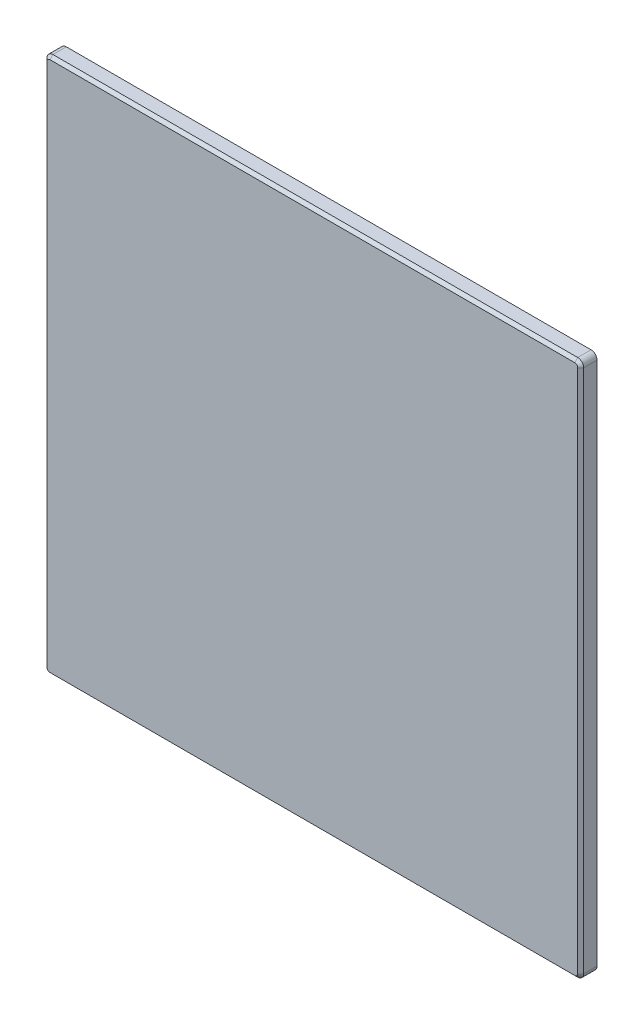
ISO-10303-21;
HEADER;
FILE_DESCRIPTION(('STEP AP214'),'2;1');
FILE_NAME('part.step','',(''),(''),'','','');
FILE_SCHEMA(('AUTOMOTIVE_DESIGN { 1 0 10303 214 1 1 1 1 }'));
ENDSEC;
DATA;
#1=APPLICATION_CONTEXT('core data for automotive mechanical design processes');
#2=APPLICATION_PROTOCOL_DEFINITION('international standard','automotive_design',2000,#1);
#3=PRODUCT_CONTEXT('',#1,'mechanical');
#4=PRODUCT('Part','Part','',(#3));
#5=PRODUCT_RELATED_PRODUCT_CATEGORY('part','',(#4));
#6=PRODUCT_DEFINITION_FORMATION('','',#4);
#7=PRODUCT_DEFINITION_CONTEXT('part definition',#1,'design');
#8=PRODUCT_DEFINITION('design','',#6,#7);
#9=PRODUCT_DEFINITION_SHAPE('','',#8);
#10=(LENGTH_UNIT() NAMED_UNIT(*) SI_UNIT(.MILLI.,.METRE.));
#11=(NAMED_UNIT(*) PLANE_ANGLE_UNIT() SI_UNIT($,.RADIAN.));
#12=(NAMED_UNIT(*) SI_UNIT($,.STERADIAN.) SOLID_ANGLE_UNIT());
#13=UNCERTAINTY_MEASURE_WITH_UNIT(LENGTH_MEASURE(1.E-05),#10,'distance_accuracy_value','');
#14=(GEOMETRIC_REPRESENTATION_CONTEXT(3) GLOBAL_UNCERTAINTY_ASSIGNED_CONTEXT((#13)) GLOBAL_UNIT_ASSIGNED_CONTEXT((#10,
#11,#12)) REPRESENTATION_CONTEXT('',''));
#15=CARTESIAN_POINT('',(0.,0.,0.));
#16=DIRECTION('',(0.,0.,1.));
#17=DIRECTION('',(1.,0.,0.));
#18=AXIS2_PLACEMENT_3D('',#15,#16,#17);
#19=CARTESIAN_POINT('',(-8.83,-8.83000000000001,0.55));
#20=DIRECTION('',(0.,0.,1.));
#21=DIRECTION('',(1.,0.,0.));
#22=AXIS2_PLACEMENT_3D('',#19,#20,#21);
#23=PLANE('',#22);
#24=DIRECTION('',(0.,1.,0.));
#25=VECTOR('',#24,1.);
#26=CARTESIAN_POINT('',(8.93,-8.83000000000001,0.55));
#27=LINE('',#26,#25);
#28=CARTESIAN_POINT('',(8.93000000000684,8.83,0.550000000010141));
#29=VERTEX_POINT('',#28);
#30=CARTESIAN_POINT('',(8.92999999998377,-8.83000000000001,0.550000000016235));
#31=VERTEX_POINT('',#30);
#32=EDGE_CURVE('E121',#29,#31,#27,.F.);
#33=ORIENTED_EDGE('',*,*,#32,.F.);
#34=CARTESIAN_POINT('',(8.82999999999999,8.83,0.549999999975626));
#35=DIRECTION('',(0.,0.,-1.));
#36=DIRECTION('',(0.,1.,0.));
#37=AXIS2_PLACEMENT_3D('',#34,#35,#36);
#38=CIRCLE('',#37,0.10000000009956);
#39=CARTESIAN_POINT('',(8.82999999999999,8.93000000001219,0.549999999987813));
#40=VERTEX_POINT('',#39);
#41=EDGE_CURVE('E144',#40,#29,#38,.T.);
#42=ORIENTED_EDGE('',*,*,#41,.F.);
#43=DIRECTION('',(1.,0.,0.));
#44=VECTOR('',#43,1.);
#45=CARTESIAN_POINT('',(-8.83,8.93,0.55));
#46=LINE('',#45,#44);
#47=CARTESIAN_POINT('',(-8.82999999999999,8.92999999998745,0.550000000032469));
#48=VERTEX_POINT('',#47);
#49=EDGE_CURVE('E116',#48,#40,#46,.T.);
#50=ORIENTED_EDGE('',*,*,#49,.F.);
#51=CARTESIAN_POINT('',(-8.82999999999999,8.83,0.550000000032469));
#52=DIRECTION('',(0.,0.,-1.));
#53=DIRECTION('',(0.,1.,0.));
#54=AXIS2_PLACEMENT_3D('',#51,#52,#53);
#55=CIRCLE('',#54,0.0999999999639224);
#56=CARTESIAN_POINT('',(-8.92999999998377,8.83,0.550000000016235));
#57=VERTEX_POINT('',#56);
#58=EDGE_CURVE('E141',#57,#48,#55,.T.);
#59=ORIENTED_EDGE('',*,*,#58,.F.);
#60=DIRECTION('',(0.,1.,0.));
#61=VECTOR('',#60,1.);
#62=CARTESIAN_POINT('',(-8.93,-8.83000000000001,0.55));
#63=LINE('',#62,#61);
#64=CARTESIAN_POINT('',(-8.93000000001219,-8.83000000000001,0.549999999987813));
#65=VERTEX_POINT('',#64);
#66=EDGE_CURVE('E97',#65,#57,#63,.T.);
#67=ORIENTED_EDGE('',*,*,#66,.F.);
#68=CARTESIAN_POINT('',(-8.83,-8.83000000000001,0.549999999975626));
#69=DIRECTION('',(0.,0.,-1.));
#70=DIRECTION('',(-1.,0.,0.));
#71=AXIS2_PLACEMENT_3D('',#68,#69,#70);
#72=CIRCLE('',#71,0.100000000020754);
#73=CARTESIAN_POINT('',(-8.83,-8.9300000000122,0.549999999987813));
#74=VERTEX_POINT('',#73);
#75=EDGE_CURVE('E20',#74,#65,#72,.T.);
#76=ORIENTED_EDGE('',*,*,#75,.F.);
#77=DIRECTION('',(1.,0.,0.));
#78=VECTOR('',#77,1.);
#79=CARTESIAN_POINT('',(-8.83,-8.93000000000001,0.55));
#80=LINE('',#79,#78);
#81=CARTESIAN_POINT('',(8.83,-8.92999999998746,0.550000000032469));
#82=VERTEX_POINT('',#81);
#83=EDGE_CURVE('E82',#82,#74,#80,.F.);
#84=ORIENTED_EDGE('',*,*,#83,.F.);
#85=CARTESIAN_POINT('',(8.83,-8.83000000000001,0.550000000032469));
#86=DIRECTION('',(0.,0.,-1.));
#87=DIRECTION('',(-1.,0.,0.));
#88=AXIS2_PLACEMENT_3D('',#85,#86,#87);
#89=CIRCLE('',#88,0.0999999999858857);
#90=EDGE_CURVE('E106',#31,#82,#89,.T.);
#91=ORIENTED_EDGE('',*,*,#90,.F.);
#92=EDGE_LOOP('',(#33,#42,#50,#59,#67,#76,#84,#91));
#93=FACE_BOUND('',#92,.T.);
#94=ADVANCED_FACE('F17',(#93),#23,.T.);
#95=CARTESIAN_POINT('',(-8.83,-8.83000000000001,0.449999999830197));
#96=DIRECTION('',(0.,0.,-1.));
#97=DIRECTION('',(-1.,0.,0.));
#98=AXIS2_PLACEMENT_3D('',#95,#96,#97);
#99=CONICAL_SURFACE('',#98,0.199999999995652,0.785398162544797);
#100=DIRECTION('',(0.707106781186545,0.,0.70710678118655));
#101=VECTOR('',#100,1.);
#102=CARTESIAN_POINT('',(-8.93,-8.83000000000001,0.55));
#103=LINE('',#102,#101);
#104=CARTESIAN_POINT('',(-9.03,-8.83000000000001,0.45));
#105=VERTEX_POINT('',#104);
#106=EDGE_CURVE('E115',#105,#65,#103,.T.);
#107=ORIENTED_EDGE('',*,*,#106,.F.);
#108=CARTESIAN_POINT('',(-8.83,-8.83000000000001,0.45));
#109=DIRECTION('',(0.,0.,-1.));
#110=DIRECTION('',(-1.,0.,0.));
#111=AXIS2_PLACEMENT_3D('',#108,#109,#110);
#112=CIRCLE('',#111,0.200000000000001);
#113=CARTESIAN_POINT('',(-8.83,-9.03000000000001,0.45));
#114=VERTEX_POINT('',#113);
#115=EDGE_CURVE('E103',#114,#105,#112,.T.);
#116=ORIENTED_EDGE('',*,*,#115,.F.);
#117=DIRECTION('',(0.,-0.707106781186545,-0.70710678118655));
#118=VECTOR('',#117,1.);
#119=CARTESIAN_POINT('',(-8.83,-8.93000000000001,0.55));
#120=LINE('',#119,#118);
#121=EDGE_CURVE('E87',#74,#114,#120,.T.);
#122=ORIENTED_EDGE('',*,*,#121,.F.);
#123=ORIENTED_EDGE('',*,*,#75,.T.);
#124=EDGE_LOOP('',(#107,#116,#122,#123));
#125=FACE_BOUND('',#124,.T.);
#126=ADVANCED_FACE('F101',(#125),#99,.T.);
#127=CARTESIAN_POINT('',(-8.83,-8.93000000000001,0.55));
#128=DIRECTION('',(0.,-0.70710678118655,0.707106781186545));
#129=DIRECTION('',(0.,-0.707106781186545,-0.70710678118655));
#130=AXIS2_PLACEMENT_3D('',#127,#128,#129);
#131=PLANE('',#130);
#132=ORIENTED_EDGE('',*,*,#121,.T.);
#133=DIRECTION('',(1.,0.,0.));
#134=VECTOR('',#133,1.);
#135=CARTESIAN_POINT('',(-8.83,-9.03000000000001,0.45));
#136=LINE('',#135,#134);
#137=CARTESIAN_POINT('',(8.83,-9.0299999999705,0.44999999997176));
#138=VERTEX_POINT('',#137);
#139=EDGE_CURVE('E164',#114,#138,#136,.T.);
#140=ORIENTED_EDGE('',*,*,#139,.T.);
#141=DIRECTION('',(0.,0.707106780551956,0.707106781821139));
#142=VECTOR('',#141,1.);
#143=CARTESIAN_POINT('',(8.83000000009167,-499009.479104346,-499000.));
#144=LINE('',#143,#142);
#145=EDGE_CURVE('E90',#82,#138,#144,.F.);
#146=ORIENTED_EDGE('',*,*,#145,.F.);
#147=ORIENTED_EDGE('',*,*,#83,.T.);
#148=EDGE_LOOP('',(#132,#140,#146,#147));
#149=FACE_BOUND('',#148,.T.);
#150=ADVANCED_FACE('F84',(#149),#131,.T.);
#151=CARTESIAN_POINT('',(8.83,-8.83000000000001,0.449999999887041));
#152=DIRECTION('',(0.,0.,-1.));
#153=DIRECTION('',(-1.,0.,0.));
#154=AXIS2_PLACEMENT_3D('',#151,#152,#153);
#155=CONICAL_SURFACE('',#154,0.19999999990394,0.78539816226058);
#156=DIRECTION('',(0.707106781186545,0.,-0.70710678118655));
#157=VECTOR('',#156,1.);
#158=CARTESIAN_POINT('',(8.93,-8.83000000000001,0.55));
#159=LINE('',#158,#157);
#160=CARTESIAN_POINT('',(9.03,-8.83000000000001,0.45));
#161=VERTEX_POINT('',#160);
#162=EDGE_CURVE('E124',#31,#161,#159,.T.);
#163=ORIENTED_EDGE('',*,*,#162,.F.);
#164=ORIENTED_EDGE('',*,*,#90,.T.);
#165=ORIENTED_EDGE('',*,*,#145,.T.);
#166=CARTESIAN_POINT('',(8.83,-8.83000000000001,0.45));
#167=DIRECTION('',(0.,0.,-1.));
#168=DIRECTION('',(-1.,0.,0.));
#169=AXIS2_PLACEMENT_3D('',#166,#167,#168);
#170=CIRCLE('',#169,0.199999999999999);
#171=EDGE_CURVE('E160',#161,#138,#170,.T.);
#172=ORIENTED_EDGE('',*,*,#171,.F.);
#173=EDGE_LOOP('',(#163,#164,#165,#172));
#174=FACE_BOUND('',#173,.T.);
#175=ADVANCED_FACE('F300',(#174),#155,.T.);
#176=CARTESIAN_POINT('',(8.93,-8.83000000000001,0.55));
#177=DIRECTION('',(0.70710678118655,0.,0.707106781186545));
#178=DIRECTION('',(0.707106781186545,0.,-0.70710678118655));
#179=AXIS2_PLACEMENT_3D('',#176,#177,#178);
#180=PLANE('',#179);
#181=DIRECTION('',(-0.707106780551954,0.,0.707106781821141));
#182=VECTOR('',#181,1.);
#183=CARTESIAN_POINT('',(499009.479104343,8.83000000006111,-499000.));
#184=LINE('',#183,#182);
#185=CARTESIAN_POINT('',(9.02999999997049,8.83,0.449999999985971));
#186=VERTEX_POINT('',#185);
#187=EDGE_CURVE('E123',#29,#186,#184,.F.);
#188=ORIENTED_EDGE('',*,*,#187,.F.);
#189=ORIENTED_EDGE('',*,*,#32,.T.);
#190=ORIENTED_EDGE('',*,*,#162,.T.);
#191=DIRECTION('',(0.,1.,0.));
#192=VECTOR('',#191,1.);
#193=CARTESIAN_POINT('',(9.03,-8.83000000000001,0.45));
#194=LINE('',#193,#192);
#195=EDGE_CURVE('E220',#161,#186,#194,.T.);
#196=ORIENTED_EDGE('',*,*,#195,.T.);
#197=EDGE_LOOP('',(#188,#189,#190,#196));
#198=FACE_BOUND('',#197,.T.);
#199=ADVANCED_FACE('F242',(#198),#180,.T.);
#200=CARTESIAN_POINT('',(8.82999999999999,8.83,0.449999999943884));
#201=DIRECTION('',(0.,0.,-1.));
#202=DIRECTION('',(0.,1.,0.));
#203=AXIS2_PLACEMENT_3D('',#200,#201,#202);
#204=CONICAL_SURFACE('',#203,0.199999999903928,0.78539816226058);
#205=DIRECTION('',(0.,-0.707106781186545,0.70710678118655));
#206=VECTOR('',#205,1.);
#207=CARTESIAN_POINT('',(8.82999999999999,8.93,0.55));
#208=LINE('',#207,#206);
#209=CARTESIAN_POINT('',(8.82999999999999,9.03,0.45));
#210=VERTEX_POINT('',#209);
#211=EDGE_CURVE('E120',#40,#210,#208,.F.);
#212=ORIENTED_EDGE('',*,*,#211,.F.);
#213=ORIENTED_EDGE('',*,*,#41,.T.);
#214=ORIENTED_EDGE('',*,*,#187,.T.);
#215=CARTESIAN_POINT('',(8.82999999999999,8.83,0.45));
#216=DIRECTION('',(0.,0.,-1.));
#217=DIRECTION('',(-1.,0.,0.));
#218=AXIS2_PLACEMENT_3D('',#215,#216,#217);
#219=CIRCLE('',#218,0.200000000000005);
#220=EDGE_CURVE('E216',#210,#186,#219,.T.);
#221=ORIENTED_EDGE('',*,*,#220,.F.);
#222=EDGE_LOOP('',(#212,#213,#214,#221));
#223=FACE_BOUND('',#222,.T.);
#224=ADVANCED_FACE('F232',(#223),#204,.T.);
#225=CARTESIAN_POINT('',(-8.83,8.93,0.55));
#226=DIRECTION('',(0.,0.70710678118655,0.707106781186545));
#227=DIRECTION('',(0.,-0.707106781186545,0.70710678118655));
#228=AXIS2_PLACEMENT_3D('',#225,#226,#227);
#229=PLANE('',#228);
#230=DIRECTION('',(0.,-0.707106780551956,0.707106781821139));
#231=VECTOR('',#230,1.);
#232=CARTESIAN_POINT('',(-8.83000000003054,499000.,-498990.520895637));
#233=LINE('',#232,#231);
#234=CARTESIAN_POINT('',(-8.82999999999999,9.0299999999847,0.449999999985971));
#235=VERTEX_POINT('',#234);
#236=EDGE_CURVE('E119',#48,#235,#233,.F.);
#237=ORIENTED_EDGE('',*,*,#236,.F.);
#238=ORIENTED_EDGE('',*,*,#49,.T.);
#239=ORIENTED_EDGE('',*,*,#211,.T.);
#240=DIRECTION('',(1.,0.,0.));
#241=VECTOR('',#240,1.);
#242=CARTESIAN_POINT('',(8.82999999999999,9.03,0.45));
#243=LINE('',#242,#241);
#244=EDGE_CURVE('E200',#210,#235,#243,.F.);
#245=ORIENTED_EDGE('',*,*,#244,.T.);
#246=EDGE_LOOP('',(#237,#238,#239,#245));
#247=FACE_BOUND('',#246,.T.);
#248=ADVANCED_FACE('F292',(#247),#229,.T.);
#249=CARTESIAN_POINT('',(-8.82999999999999,8.83,0.449999999943884));
#250=DIRECTION('',(0.,0.,-1.));
#251=DIRECTION('',(0.,1.,0.));
#252=AXIS2_PLACEMENT_3D('',#249,#250,#251);
#253=CONICAL_SURFACE('',#252,0.19999999993882,0.785398162829014);
#254=DIRECTION('',(0.707106781186545,0.,0.70710678118655));
#255=VECTOR('',#254,1.);
#256=CARTESIAN_POINT('',(-8.93,8.83,0.55));
#257=LINE('',#256,#255);
#258=CARTESIAN_POINT('',(-9.03,8.83,0.45));
#259=VERTEX_POINT('',#258);
#260=EDGE_CURVE('E114',#57,#259,#257,.F.);
#261=ORIENTED_EDGE('',*,*,#260,.F.);
#262=ORIENTED_EDGE('',*,*,#58,.T.);
#263=ORIENTED_EDGE('',*,*,#236,.T.);
#264=CARTESIAN_POINT('',(-8.82999999999999,8.83,0.45));
#265=DIRECTION('',(0.,0.,-1.));
#266=DIRECTION('',(-1.,0.,0.));
#267=AXIS2_PLACEMENT_3D('',#264,#265,#266);
#268=CIRCLE('',#267,0.199999999999999);
#269=EDGE_CURVE('E196',#259,#235,#268,.T.);
#270=ORIENTED_EDGE('',*,*,#269,.F.);
#271=EDGE_LOOP('',(#261,#262,#263,#270));
#272=FACE_BOUND('',#271,.T.);
#273=ADVANCED_FACE('F336',(#272),#253,.T.);
#274=CARTESIAN_POINT('',(-8.93,-8.83000000000001,0.55));
#275=DIRECTION('',(-0.70710678118655,0.,0.707106781186545));
#276=DIRECTION('',(0.707106781186545,0.,0.70710678118655));
#277=AXIS2_PLACEMENT_3D('',#274,#275,#276);
#278=PLANE('',#277);
#279=ORIENTED_EDGE('',*,*,#260,.T.);
#280=DIRECTION('',(0.,1.,0.));
#281=VECTOR('',#280,1.);
#282=CARTESIAN_POINT('',(-9.03,8.83,0.45));
#283=LINE('',#282,#281);
#284=EDGE_CURVE('E184',#259,#105,#283,.F.);
#285=ORIENTED_EDGE('',*,*,#284,.T.);
#286=ORIENTED_EDGE('',*,*,#106,.T.);
#287=ORIENTED_EDGE('',*,*,#66,.T.);
#288=EDGE_LOOP('',(#279,#285,#286,#287));
#289=FACE_BOUND('',#288,.T.);
#290=ADVANCED_FACE('F333',(#289),#278,.T.);
#291=CARTESIAN_POINT('',(-8.83,-8.83000000000001,0.55));
#292=DIRECTION('',(0.,0.,-1.));
#293=DIRECTION('',(-1.,0.,0.));
#294=AXIS2_PLACEMENT_3D('',#291,#292,#293);
#295=CYLINDRICAL_SURFACE('',#294,0.200000000000001);
#296=DIRECTION('',(0.,0.,-1.));
#297=VECTOR('',#296,1.);
#298=CARTESIAN_POINT('',(-9.03,-8.83000000000001,0.55));
#299=LINE('',#298,#297);
#300=CARTESIAN_POINT('',(-9.03,-8.83000000000001,0.));
#301=VERTEX_POINT('',#300);
#302=EDGE_CURVE('E140',#105,#301,#299,.T.);
#303=ORIENTED_EDGE('',*,*,#302,.T.);
#304=CARTESIAN_POINT('',(-8.83,-8.83000000000001,0.));
#305=DIRECTION('',(0.,0.,-1.));
#306=DIRECTION('',(-1.,0.,0.));
#307=AXIS2_PLACEMENT_3D('',#304,#305,#306);
#308=CIRCLE('',#307,0.200000000000001);
#309=CARTESIAN_POINT('',(-8.83,-9.03000000000001,0.));
#310=VERTEX_POINT('',#309);
#311=EDGE_CURVE('E137',#301,#310,#308,.F.);
#312=ORIENTED_EDGE('',*,*,#311,.T.);
#313=DIRECTION('',(0.,0.,1.));
#314=VECTOR('',#313,1.);
#315=CARTESIAN_POINT('',(-8.83,-9.03000000000001,0.55));
#316=LINE('',#315,#314);
#317=EDGE_CURVE('E168',#310,#114,#316,.T.);
#318=ORIENTED_EDGE('',*,*,#317,.T.);
#319=ORIENTED_EDGE('',*,*,#115,.T.);
#320=EDGE_LOOP('',(#303,#312,#318,#319));
#321=FACE_BOUND('',#320,.T.);
#322=ADVANCED_FACE('F330',(#321),#295,.T.);
#323=CARTESIAN_POINT('',(-8.83,-9.03000000000001,0.55));
#324=DIRECTION('',(0.,1.,0.));
#325=DIRECTION('',(0.,0.,1.));
#326=AXIS2_PLACEMENT_3D('',#323,#324,#325);
#327=PLANE('',#326);
#328=ORIENTED_EDGE('',*,*,#139,.F.);
#329=ORIENTED_EDGE('',*,*,#317,.F.);
#330=DIRECTION('',(1.,0.,0.));
#331=VECTOR('',#330,1.);
#332=CARTESIAN_POINT('',(-8.83,-9.03000000000001,0.));
#333=LINE('',#332,#331);
#334=CARTESIAN_POINT('',(8.83,-9.03000000000001,0.));
#335=VERTEX_POINT('',#334);
#336=EDGE_CURVE('E136',#310,#335,#333,.T.);
#337=ORIENTED_EDGE('',*,*,#336,.T.);
#338=DIRECTION('',(0.,0.,-1.));
#339=VECTOR('',#338,1.);
#340=CARTESIAN_POINT('',(8.83,-9.03000000000001,0.55));
#341=LINE('',#340,#339);
#342=EDGE_CURVE('E163',#138,#335,#341,.T.);
#343=ORIENTED_EDGE('',*,*,#342,.F.);
#344=EDGE_LOOP('',(#328,#329,#337,#343));
#345=FACE_BOUND('',#344,.T.);
#346=ADVANCED_FACE('F266',(#345),#327,.F.);
#347=CARTESIAN_POINT('',(8.83,-8.83000000000001,0.55));
#348=DIRECTION('',(0.,0.,-1.));
#349=DIRECTION('',(-1.,0.,0.));
#350=AXIS2_PLACEMENT_3D('',#347,#348,#349);
#351=CYLINDRICAL_SURFACE('',#350,0.199999999999999);
#352=ORIENTED_EDGE('',*,*,#342,.T.);
#353=CARTESIAN_POINT('',(8.83,-8.83000000000001,0.));
#354=DIRECTION('',(0.,0.,-1.));
#355=DIRECTION('',(-1.,0.,0.));
#356=AXIS2_PLACEMENT_3D('',#353,#354,#355);
#357=CIRCLE('',#356,0.199999999999999);
#358=CARTESIAN_POINT('',(9.03,-8.83000000000001,0.));
#359=VERTEX_POINT('',#358);
#360=EDGE_CURVE('E133',#335,#359,#357,.F.);
#361=ORIENTED_EDGE('',*,*,#360,.T.);
#362=DIRECTION('',(0.,0.,1.));
#363=VECTOR('',#362,1.);
#364=CARTESIAN_POINT('',(9.03,-8.83000000000001,0.55));
#365=LINE('',#364,#363);
#366=EDGE_CURVE('E224',#359,#161,#365,.T.);
#367=ORIENTED_EDGE('',*,*,#366,.T.);
#368=ORIENTED_EDGE('',*,*,#171,.T.);
#369=EDGE_LOOP('',(#352,#361,#367,#368));
#370=FACE_BOUND('',#369,.T.);
#371=ADVANCED_FACE('F259',(#370),#351,.T.);
#372=CARTESIAN_POINT('',(9.03,-8.83000000000001,0.55));
#373=DIRECTION('',(-1.,0.,0.));
#374=DIRECTION('',(0.,0.,1.));
#375=AXIS2_PLACEMENT_3D('',#372,#373,#374);
#376=PLANE('',#375);
#377=ORIENTED_EDGE('',*,*,#195,.F.);
#378=ORIENTED_EDGE('',*,*,#366,.F.);
#379=DIRECTION('',(0.,1.,0.));
#380=VECTOR('',#379,1.);
#381=CARTESIAN_POINT('',(9.02999999999999,-8.83000000000001,0.));
#382=LINE('',#381,#380);
#383=CARTESIAN_POINT('',(9.02999999999999,8.83,0.));
#384=VERTEX_POINT('',#383);
#385=EDGE_CURVE('E132',#359,#384,#382,.T.);
#386=ORIENTED_EDGE('',*,*,#385,.T.);
#387=DIRECTION('',(0.,0.,-1.));
#388=VECTOR('',#387,1.);
#389=CARTESIAN_POINT('',(9.02999999999999,8.83,0.55));
#390=LINE('',#389,#388);
#391=EDGE_CURVE('E219',#186,#384,#390,.T.);
#392=ORIENTED_EDGE('',*,*,#391,.F.);
#393=EDGE_LOOP('',(#377,#378,#386,#392));
#394=FACE_BOUND('',#393,.T.);
#395=ADVANCED_FACE('F246',(#394),#376,.F.);
#396=CARTESIAN_POINT('',(8.82999999999999,8.83,0.55));
#397=DIRECTION('',(0.,0.,-1.));
#398=DIRECTION('',(-1.,0.,0.));
#399=AXIS2_PLACEMENT_3D('',#396,#397,#398);
#400=CYLINDRICAL_SURFACE('',#399,0.200000000000005);
#401=ORIENTED_EDGE('',*,*,#391,.T.);
#402=CARTESIAN_POINT('',(8.82999999999999,8.83,0.));
#403=DIRECTION('',(0.,0.,-1.));
#404=DIRECTION('',(-1.,0.,0.));
#405=AXIS2_PLACEMENT_3D('',#402,#403,#404);
#406=CIRCLE('',#405,0.200000000000005);
#407=CARTESIAN_POINT('',(8.82999999999999,9.03,0.));
#408=VERTEX_POINT('',#407);
#409=EDGE_CURVE('E129',#384,#408,#406,.F.);
#410=ORIENTED_EDGE('',*,*,#409,.T.);
#411=DIRECTION('',(0.,0.,-1.));
#412=VECTOR('',#411,1.);
#413=CARTESIAN_POINT('',(8.82999999999999,9.03,0.55));
#414=LINE('',#413,#412);
#415=EDGE_CURVE('E205',#408,#210,#414,.F.);
#416=ORIENTED_EDGE('',*,*,#415,.T.);
#417=ORIENTED_EDGE('',*,*,#220,.T.);
#418=EDGE_LOOP('',(#401,#410,#416,#417));
#419=FACE_BOUND('',#418,.T.);
#420=ADVANCED_FACE('F238',(#419),#400,.T.);
#421=CARTESIAN_POINT('',(8.82999999999999,9.03,0.55));
#422=DIRECTION('',(0.,-1.,0.));
#423=DIRECTION('',(0.,0.,-1.));
#424=AXIS2_PLACEMENT_3D('',#421,#422,#423);
#425=PLANE('',#424);
#426=ORIENTED_EDGE('',*,*,#244,.F.);
#427=ORIENTED_EDGE('',*,*,#415,.F.);
#428=DIRECTION('',(1.,0.,0.));
#429=VECTOR('',#428,1.);
#430=CARTESIAN_POINT('',(-8.83,9.03,0.));
#431=LINE('',#430,#429);
#432=CARTESIAN_POINT('',(-8.82999999999999,9.03,0.));
#433=VERTEX_POINT('',#432);
#434=EDGE_CURVE('E128',#408,#433,#431,.F.);
#435=ORIENTED_EDGE('',*,*,#434,.T.);
#436=DIRECTION('',(0.,0.,-1.));
#437=VECTOR('',#436,1.);
#438=CARTESIAN_POINT('',(-8.82999999999999,9.03,0.55));
#439=LINE('',#438,#437);
#440=EDGE_CURVE('E199',#235,#433,#439,.T.);
#441=ORIENTED_EDGE('',*,*,#440,.F.);
#442=EDGE_LOOP('',(#426,#427,#435,#441));
#443=FACE_BOUND('',#442,.T.);
#444=ADVANCED_FACE('F288',(#443),#425,.F.);
#445=CARTESIAN_POINT('',(-8.82999999999999,8.83,0.55));
#446=DIRECTION('',(0.,0.,-1.));
#447=DIRECTION('',(-1.,0.,0.));
#448=AXIS2_PLACEMENT_3D('',#445,#446,#447);
#449=CYLINDRICAL_SURFACE('',#448,0.199999999999999);
#450=ORIENTED_EDGE('',*,*,#440,.T.);
#451=CARTESIAN_POINT('',(-8.82999999999999,8.83,0.));
#452=DIRECTION('',(0.,0.,-1.));
#453=DIRECTION('',(-1.,0.,0.));
#454=AXIS2_PLACEMENT_3D('',#451,#452,#453);
#455=CIRCLE('',#454,0.199999999999999);
#456=CARTESIAN_POINT('',(-9.03,8.83,0.));
#457=VERTEX_POINT('',#456);
#458=EDGE_CURVE('E26',#433,#457,#455,.F.);
#459=ORIENTED_EDGE('',*,*,#458,.T.);
#460=DIRECTION('',(0.,0.,-1.));
#461=VECTOR('',#460,1.);
#462=CARTESIAN_POINT('',(-9.03,8.83,0.55));
#463=LINE('',#462,#461);
#464=EDGE_CURVE('E34',#457,#259,#463,.F.);
#465=ORIENTED_EDGE('',*,*,#464,.T.);
#466=ORIENTED_EDGE('',*,*,#269,.T.);
#467=EDGE_LOOP('',(#450,#459,#465,#466));
#468=FACE_BOUND('',#467,.T.);
#469=ADVANCED_FACE('F282',(#468),#449,.T.);
#470=CARTESIAN_POINT('',(-9.03,8.83,0.55));
#471=DIRECTION('',(1.,0.,0.));
#472=DIRECTION('',(0.,0.,-1.));
#473=AXIS2_PLACEMENT_3D('',#470,#471,#472);
#474=PLANE('',#473);
#475=ORIENTED_EDGE('',*,*,#284,.F.);
#476=ORIENTED_EDGE('',*,*,#464,.F.);
#477=DIRECTION('',(0.,1.,0.));
#478=VECTOR('',#477,1.);
#479=CARTESIAN_POINT('',(-9.03,-8.83000000000001,0.));
#480=LINE('',#479,#478);
#481=EDGE_CURVE('E11',#457,#301,#480,.F.);
#482=ORIENTED_EDGE('',*,*,#481,.T.);
#483=ORIENTED_EDGE('',*,*,#302,.F.);
#484=EDGE_LOOP('',(#475,#476,#482,#483));
#485=FACE_BOUND('',#484,.T.);
#486=ADVANCED_FACE('F311',(#485),#474,.F.);
#487=CARTESIAN_POINT('',(-8.83,-8.83000000000001,0.));
#488=DIRECTION('',(0.,0.,1.));
#489=DIRECTION('',(1.,0.,0.));
#490=AXIS2_PLACEMENT_3D('',#487,#488,#489);
#491=PLANE('',#490);
#492=ORIENTED_EDGE('',*,*,#458,.F.);
#493=ORIENTED_EDGE('',*,*,#434,.F.);
#494=ORIENTED_EDGE('',*,*,#409,.F.);
#495=ORIENTED_EDGE('',*,*,#385,.F.);
#496=ORIENTED_EDGE('',*,*,#360,.F.);
#497=ORIENTED_EDGE('',*,*,#336,.F.);
#498=ORIENTED_EDGE('',*,*,#311,.F.);
#499=ORIENTED_EDGE('',*,*,#481,.F.);
#500=EDGE_LOOP('',(#492,#493,#494,#495,#496,#497,#498,#499));
#501=FACE_BOUND('',#500,.T.);
#502=ADVANCED_FACE('F265',(#501),#491,.F.);
#503=CLOSED_SHELL('',(#94,#126,#150,#175,#199,#224,#248,#273,#290,#322,#346,#371,#395,#420,#444,
#469,#486,#502));
#504=MANIFOLD_SOLID_BREP('B1',#503);
#505=ADVANCED_BREP_SHAPE_REPRESENTATION('',(#18,#504),#14);
#506=SHAPE_DEFINITION_REPRESENTATION(#9,#505);
ENDSEC;
END-ISO-10303-21;
